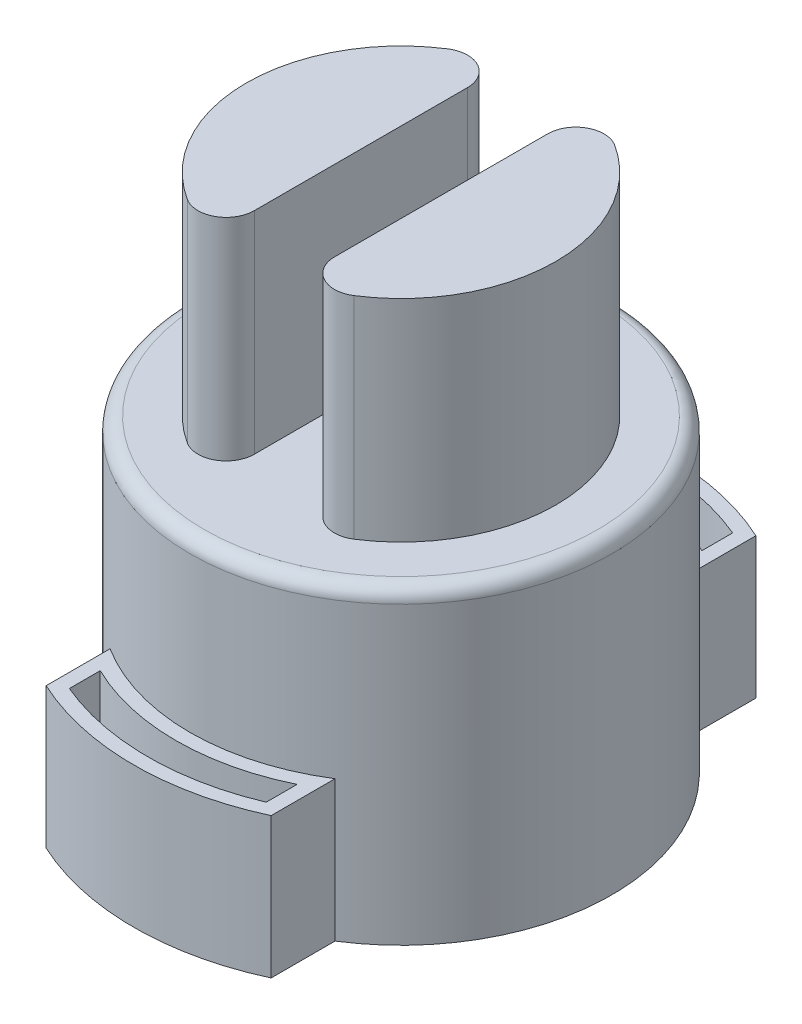
ISO-10303-21;
HEADER;
FILE_DESCRIPTION(('STEP AP214'),'2;1');
FILE_NAME('part.step','',(''),(''),'','','');
FILE_SCHEMA(('AUTOMOTIVE_DESIGN { 1 0 10303 214 1 1 1 1 }'));
ENDSEC;
DATA;
#1=APPLICATION_CONTEXT('core data for automotive mechanical design processes');
#2=APPLICATION_PROTOCOL_DEFINITION('international standard','automotive_design',2000,#1);
#3=PRODUCT_CONTEXT('',#1,'mechanical');
#4=PRODUCT('Part','Part','',(#3));
#5=PRODUCT_RELATED_PRODUCT_CATEGORY('part','',(#4));
#6=PRODUCT_DEFINITION_FORMATION('','',#4);
#7=PRODUCT_DEFINITION_CONTEXT('part definition',#1,'design');
#8=PRODUCT_DEFINITION('design','',#6,#7);
#9=PRODUCT_DEFINITION_SHAPE('','',#8);
#10=(LENGTH_UNIT() NAMED_UNIT(*) SI_UNIT(.MILLI.,.METRE.));
#11=(NAMED_UNIT(*) PLANE_ANGLE_UNIT() SI_UNIT($,.RADIAN.));
#12=(NAMED_UNIT(*) SI_UNIT($,.STERADIAN.) SOLID_ANGLE_UNIT());
#13=UNCERTAINTY_MEASURE_WITH_UNIT(LENGTH_MEASURE(1.E-05),#10,'distance_accuracy_value','');
#14=(GEOMETRIC_REPRESENTATION_CONTEXT(3) GLOBAL_UNCERTAINTY_ASSIGNED_CONTEXT((#13)) GLOBAL_UNIT_ASSIGNED_CONTEXT((#10,
#11,#12)) REPRESENTATION_CONTEXT('',''));
#15=CARTESIAN_POINT('',(0.,0.,0.));
#16=DIRECTION('',(0.,0.,1.));
#17=DIRECTION('',(1.,0.,0.));
#18=AXIS2_PLACEMENT_3D('',#15,#16,#17);
#19=CARTESIAN_POINT('',(0.,15.,0.));
#20=DIRECTION('',(0.,-1.,0.));
#21=DIRECTION('',(0.,0.,-1.));
#22=AXIS2_PLACEMENT_3D('',#19,#20,#21);
#23=CYLINDRICAL_SURFACE('',#22,11.);
#24=CARTESIAN_POINT('',(0.,15.,0.));
#25=DIRECTION('',(0.,1.,0.));
#26=DIRECTION('',(0.,0.,1.));
#27=AXIS2_PLACEMENT_3D('',#24,#25,#26);
#28=CIRCLE('',#27,11.);
#29=CARTESIAN_POINT('',(-5.92777777777778,15.,-9.26614540233877));
#30=VERTEX_POINT('',#29);
#31=CARTESIAN_POINT('',(-5.92777777777778,15.,9.26614540233877));
#32=VERTEX_POINT('',#31);
#33=EDGE_CURVE('E381',#30,#32,#28,.T.);
#34=ORIENTED_EDGE('',*,*,#33,.F.);
#35=DIRECTION('',(0.,-1.,0.));
#36=VECTOR('',#35,1.);
#37=CARTESIAN_POINT('',(-5.92777777777778,15.,-9.26614540233877));
#38=LINE('',#37,#36);
#39=CARTESIAN_POINT('',(-5.92777777777778,0.,-9.26614540233877));
#40=VERTEX_POINT('',#39);
#41=EDGE_CURVE('E411',#30,#40,#38,.T.);
#42=ORIENTED_EDGE('',*,*,#41,.T.);
#43=CARTESIAN_POINT('',(0.,0.,0.));
#44=DIRECTION('',(0.,1.,0.));
#45=DIRECTION('',(0.,0.,1.));
#46=AXIS2_PLACEMENT_3D('',#43,#44,#45);
#47=CIRCLE('',#46,11.);
#48=CARTESIAN_POINT('',(-5.92777777777778,0.,9.26614540233877));
#49=VERTEX_POINT('',#48);
#50=EDGE_CURVE('E386',#40,#49,#47,.T.);
#51=ORIENTED_EDGE('',*,*,#50,.T.);
#52=DIRECTION('',(0.,-1.,0.));
#53=VECTOR('',#52,1.);
#54=CARTESIAN_POINT('',(-5.92777777777778,15.,9.26614540233877));
#55=LINE('',#54,#53);
#56=EDGE_CURVE('E407',#49,#32,#55,.F.);
#57=ORIENTED_EDGE('',*,*,#56,.T.);
#58=EDGE_LOOP('',(#34,#42,#51,#57));
#59=FACE_BOUND('',#58,.T.);
#60=ADVANCED_FACE('F43',(#59),#23,.T.);
#61=CARTESIAN_POINT('',(0.,15.,0.));
#62=DIRECTION('',(0.,1.,0.));
#63=DIRECTION('',(0.,0.,1.));
#64=AXIS2_PLACEMENT_3D('',#61,#62,#63);
#65=PLANE('',#64);
#66=DIRECTION('',(0.,0.,1.));
#67=VECTOR('',#66,1.);
#68=CARTESIAN_POINT('',(-2.85,15.,0.));
#69=LINE('',#68,#67);
#70=CARTESIAN_POINT('',(-2.85,15.,-7.58139169282263));
#71=VERTEX_POINT('',#70);
#72=CARTESIAN_POINT('',(-2.85,15.,7.58139169282263));
#73=VERTEX_POINT('',#72);
#74=EDGE_CURVE('E395',#71,#73,#69,.T.);
#75=ORIENTED_EDGE('',*,*,#74,.F.);
#76=CARTESIAN_POINT('',(-4.85,15.,-7.58139169282263));
#77=DIRECTION('',(0.,1.,0.));
#78=DIRECTION('',(0.,0.,1.));
#79=AXIS2_PLACEMENT_3D('',#76,#77,#78);
#80=CIRCLE('',#79,2.);
#81=EDGE_CURVE('E424',#71,#30,#80,.T.);
#82=ORIENTED_EDGE('',*,*,#81,.T.);
#83=ORIENTED_EDGE('',*,*,#33,.T.);
#84=CARTESIAN_POINT('',(-4.85,15.,7.58139169282263));
#85=DIRECTION('',(0.,1.,0.));
#86=DIRECTION('',(0.,0.,1.));
#87=AXIS2_PLACEMENT_3D('',#84,#85,#86);
#88=CIRCLE('',#87,2.);
#89=EDGE_CURVE('E421',#32,#73,#88,.T.);
#90=ORIENTED_EDGE('',*,*,#89,.T.);
#91=EDGE_LOOP('',(#75,#82,#83,#90));
#92=FACE_BOUND('',#91,.T.);
#93=ADVANCED_FACE('F471',(#92),#65,.T.);
#94=CARTESIAN_POINT('',(0.,-20.,0.));
#95=DIRECTION('',(0.,1.,0.));
#96=DIRECTION('',(0.,0.,1.));
#97=AXIS2_PLACEMENT_3D('',#94,#95,#96);
#98=CYLINDRICAL_SURFACE('',#97,15.);
#99=DIRECTION('',(0.,1.,0.));
#100=VECTOR('',#99,1.);
#101=CARTESIAN_POINT('',(-8.,-22.,12.6885775404495));
#102=LINE('',#101,#100);
#103=CARTESIAN_POINT('',(-8.,-22.,12.6885775404495));
#104=VERTEX_POINT('',#103);
#105=CARTESIAN_POINT('',(-8.,-12.,12.6885775404495));
#106=VERTEX_POINT('',#105);
#107=EDGE_CURVE('E358',#104,#106,#102,.T.);
#108=ORIENTED_EDGE('',*,*,#107,.T.);
#109=CARTESIAN_POINT('',(0.,-12.,0.));
#110=DIRECTION('',(0.,-1.,0.));
#111=DIRECTION('',(0.,0.,-1.));
#112=AXIS2_PLACEMENT_3D('',#109,#110,#111);
#113=CIRCLE('',#112,15.);
#114=CARTESIAN_POINT('',(8.,-12.,12.6885775404495));
#115=VERTEX_POINT('',#114);
#116=EDGE_CURVE('E291',#115,#106,#113,.T.);
#117=ORIENTED_EDGE('',*,*,#116,.F.);
#118=DIRECTION('',(0.,1.,0.));
#119=VECTOR('',#118,1.);
#120=CARTESIAN_POINT('',(8.,-22.,12.6885775404495));
#121=LINE('',#120,#119);
#122=CARTESIAN_POINT('',(8.,-22.,12.6885775404495));
#123=VERTEX_POINT('',#122);
#124=EDGE_CURVE('E367',#123,#115,#121,.T.);
#125=ORIENTED_EDGE('',*,*,#124,.F.);
#126=CARTESIAN_POINT('',(0.,-22.,0.));
#127=DIRECTION('',(0.,-1.,0.));
#128=DIRECTION('',(0.,0.,-1.));
#129=AXIS2_PLACEMENT_3D('',#126,#127,#128);
#130=CIRCLE('',#129,15.);
#131=CARTESIAN_POINT('',(8.,-22.,-12.6885775404495));
#132=VERTEX_POINT('',#131);
#133=EDGE_CURVE('E327',#132,#123,#130,.T.);
#134=ORIENTED_EDGE('',*,*,#133,.F.);
#135=DIRECTION('',(0.,1.,0.));
#136=VECTOR('',#135,1.);
#137=CARTESIAN_POINT('',(8.,-22.,-12.6885775404495));
#138=LINE('',#137,#136);
#139=CARTESIAN_POINT('',(8.,-12.,-12.6885775404495));
#140=VERTEX_POINT('',#139);
#141=EDGE_CURVE('E370',#132,#140,#138,.T.);
#142=ORIENTED_EDGE('',*,*,#141,.T.);
#143=CARTESIAN_POINT('',(0.,-12.,0.));
#144=DIRECTION('',(0.,-1.,0.));
#145=DIRECTION('',(0.,0.,-1.));
#146=AXIS2_PLACEMENT_3D('',#143,#144,#145);
#147=CIRCLE('',#146,15.);
#148=CARTESIAN_POINT('',(-8.,-12.,-12.6885775404495));
#149=VERTEX_POINT('',#148);
#150=EDGE_CURVE('E307',#149,#140,#147,.T.);
#151=ORIENTED_EDGE('',*,*,#150,.F.);
#152=DIRECTION('',(0.,1.,0.));
#153=VECTOR('',#152,1.);
#154=CARTESIAN_POINT('',(-8.,-22.,-12.6885775404495));
#155=LINE('',#154,#153);
#156=CARTESIAN_POINT('',(-8.,-22.,-12.6885775404495));
#157=VERTEX_POINT('',#156);
#158=EDGE_CURVE('E355',#157,#149,#155,.T.);
#159=ORIENTED_EDGE('',*,*,#158,.F.);
#160=CARTESIAN_POINT('',(0.,-22.,0.));
#161=DIRECTION('',(0.,-1.,0.));
#162=DIRECTION('',(0.,0.,-1.));
#163=AXIS2_PLACEMENT_3D('',#160,#161,#162);
#164=CIRCLE('',#163,15.);
#165=EDGE_CURVE('E340',#104,#157,#164,.T.);
#166=ORIENTED_EDGE('',*,*,#165,.F.);
#167=EDGE_LOOP('',(#108,#117,#125,#134,#142,#151,#159,#166));
#168=FACE_BOUND('',#167,.T.);
#169=CARTESIAN_POINT('',(0.,-1.,0.));
#170=DIRECTION('',(0.,1.,0.));
#171=DIRECTION('',(0.,0.,1.));
#172=AXIS2_PLACEMENT_3D('',#169,#170,#171);
#173=CIRCLE('',#172,15.);
#174=CARTESIAN_POINT('',(0.,-1.,15.));
#175=VERTEX_POINT('',#174);
#176=EDGE_CURVE('E403',#175,#175,#173,.F.);
#177=ORIENTED_EDGE('',*,*,#176,.T.);
#178=EDGE_LOOP('',(#177));
#179=FACE_BOUND('',#178,.T.);
#180=ADVANCED_FACE('F498',(#168,#179),#98,.T.);
#181=CARTESIAN_POINT('',(0.,0.,0.));
#182=DIRECTION('',(0.,1.,0.));
#183=DIRECTION('',(0.,0.,1.));
#184=AXIS2_PLACEMENT_3D('',#181,#182,#183);
#185=PLANE('',#184);
#186=CARTESIAN_POINT('',(0.,0.,0.));
#187=DIRECTION('',(0.,1.,0.));
#188=DIRECTION('',(0.,0.,1.));
#189=AXIS2_PLACEMENT_3D('',#186,#187,#188);
#190=CIRCLE('',#189,14.);
#191=CARTESIAN_POINT('',(0.,0.,14.));
#192=VERTEX_POINT('',#191);
#193=EDGE_CURVE('E399',#192,#192,#190,.T.);
#194=ORIENTED_EDGE('',*,*,#193,.T.);
#195=EDGE_LOOP('',(#194));
#196=FACE_BOUND('',#195,.T.);
#197=ORIENTED_EDGE('',*,*,#50,.F.);
#198=CARTESIAN_POINT('',(-4.85,0.,-7.58139169282263));
#199=DIRECTION('',(0.,1.,0.));
#200=DIRECTION('',(0.,0.,1.));
#201=AXIS2_PLACEMENT_3D('',#198,#199,#200);
#202=CIRCLE('',#201,2.);
#203=CARTESIAN_POINT('',(-2.85,0.,-7.58139169282263));
#204=VERTEX_POINT('',#203);
#205=EDGE_CURVE('E447',#40,#204,#202,.F.);
#206=ORIENTED_EDGE('',*,*,#205,.T.);
#207=DIRECTION('',(0.,0.,1.));
#208=VECTOR('',#207,1.);
#209=CARTESIAN_POINT('',(-2.85,0.,-12.));
#210=LINE('',#209,#208);
#211=CARTESIAN_POINT('',(-2.85,0.,7.58139169282263));
#212=VERTEX_POINT('',#211);
#213=EDGE_CURVE('E373',#204,#212,#210,.T.);
#214=ORIENTED_EDGE('',*,*,#213,.T.);
#215=CARTESIAN_POINT('',(-4.85,0.,7.58139169282263));
#216=DIRECTION('',(0.,1.,0.));
#217=DIRECTION('',(0.,0.,1.));
#218=AXIS2_PLACEMENT_3D('',#215,#216,#217);
#219=CIRCLE('',#218,2.);
#220=EDGE_CURVE('E52',#212,#49,#219,.F.);
#221=ORIENTED_EDGE('',*,*,#220,.T.);
#222=EDGE_LOOP('',(#197,#206,#214,#221));
#223=FACE_BOUND('',#222,.T.);
#224=CARTESIAN_POINT('',(5.92777777777778,0.,9.26614540233877));
#225=VERTEX_POINT('',#224);
#226=CARTESIAN_POINT('',(5.92777777777778,0.,-9.26614540233877));
#227=VERTEX_POINT('',#226);
#228=EDGE_CURVE('E387',#225,#227,#47,.T.);
#229=ORIENTED_EDGE('',*,*,#228,.F.);
#230=CARTESIAN_POINT('',(4.85,0.,7.58139169282263));
#231=DIRECTION('',(0.,1.,0.));
#232=DIRECTION('',(0.,0.,1.));
#233=AXIS2_PLACEMENT_3D('',#230,#231,#232);
#234=CIRCLE('',#233,2.);
#235=CARTESIAN_POINT('',(2.85,0.,7.58139169282263));
#236=VERTEX_POINT('',#235);
#237=EDGE_CURVE('E11',#225,#236,#234,.F.);
#238=ORIENTED_EDGE('',*,*,#237,.T.);
#239=DIRECTION('',(0.,0.,-1.));
#240=VECTOR('',#239,1.);
#241=CARTESIAN_POINT('',(2.85,0.,-12.));
#242=LINE('',#241,#240);
#243=CARTESIAN_POINT('',(2.85,0.,-7.58139169282263));
#244=VERTEX_POINT('',#243);
#245=EDGE_CURVE('E377',#236,#244,#242,.T.);
#246=ORIENTED_EDGE('',*,*,#245,.T.);
#247=CARTESIAN_POINT('',(4.85,0.,-7.58139169282263));
#248=DIRECTION('',(0.,1.,0.));
#249=DIRECTION('',(0.,0.,1.));
#250=AXIS2_PLACEMENT_3D('',#247,#248,#249);
#251=CIRCLE('',#250,2.);
#252=EDGE_CURVE('E450',#244,#227,#251,.F.);
#253=ORIENTED_EDGE('',*,*,#252,.T.);
#254=EDGE_LOOP('',(#229,#238,#246,#253));
#255=FACE_BOUND('',#254,.T.);
#256=ADVANCED_FACE('F457',(#196,#223,#255),#185,.T.);
#257=ORIENTED_EDGE('',*,*,#228,.T.);
#258=DIRECTION('',(0.,-1.,0.));
#259=VECTOR('',#258,1.);
#260=CARTESIAN_POINT('',(5.92777777777778,15.,-9.26614540233877));
#261=LINE('',#260,#259);
#262=CARTESIAN_POINT('',(5.92777777777778,15.,-9.26614540233877));
#263=VERTEX_POINT('',#262);
#264=EDGE_CURVE('E431',#227,#263,#261,.F.);
#265=ORIENTED_EDGE('',*,*,#264,.T.);
#266=CARTESIAN_POINT('',(5.92777777777778,15.,9.26614540233877));
#267=VERTEX_POINT('',#266);
#268=EDGE_CURVE('E382',#267,#263,#28,.T.);
#269=ORIENTED_EDGE('',*,*,#268,.F.);
#270=DIRECTION('',(0.,-1.,0.));
#271=VECTOR('',#270,1.);
#272=CARTESIAN_POINT('',(5.92777777777778,15.,9.26614540233877));
#273=LINE('',#272,#271);
#274=EDGE_CURVE('E427',#267,#225,#273,.T.);
#275=ORIENTED_EDGE('',*,*,#274,.T.);
#276=EDGE_LOOP('',(#257,#265,#269,#275));
#277=FACE_BOUND('',#276,.T.);
#278=ADVANCED_FACE('F494',(#277),#23,.T.);
#279=ORIENTED_EDGE('',*,*,#268,.T.);
#280=CARTESIAN_POINT('',(4.85,15.,-7.58139169282263));
#281=DIRECTION('',(0.,1.,0.));
#282=DIRECTION('',(0.,0.,1.));
#283=AXIS2_PLACEMENT_3D('',#280,#281,#282);
#284=CIRCLE('',#283,2.);
#285=CARTESIAN_POINT('',(2.85,15.,-7.58139169282263));
#286=VERTEX_POINT('',#285);
#287=EDGE_CURVE('E438',#263,#286,#284,.T.);
#288=ORIENTED_EDGE('',*,*,#287,.T.);
#289=DIRECTION('',(0.,0.,-1.));
#290=VECTOR('',#289,1.);
#291=CARTESIAN_POINT('',(2.85,15.,0.));
#292=LINE('',#291,#290);
#293=CARTESIAN_POINT('',(2.85,15.,7.58139169282263));
#294=VERTEX_POINT('',#293);
#295=EDGE_CURVE('E391',#294,#286,#292,.T.);
#296=ORIENTED_EDGE('',*,*,#295,.F.);
#297=CARTESIAN_POINT('',(4.85,15.,7.58139169282263));
#298=DIRECTION('',(0.,1.,0.));
#299=DIRECTION('',(0.,0.,1.));
#300=AXIS2_PLACEMENT_3D('',#297,#298,#299);
#301=CIRCLE('',#300,2.);
#302=EDGE_CURVE('E435',#294,#267,#301,.T.);
#303=ORIENTED_EDGE('',*,*,#302,.T.);
#304=EDGE_LOOP('',(#279,#288,#296,#303));
#305=FACE_BOUND('',#304,.T.);
#306=ADVANCED_FACE('F500',(#305),#65,.T.);
#307=CARTESIAN_POINT('',(-2.85,0.,-12.));
#308=DIRECTION('',(-1.,0.,0.));
#309=DIRECTION('',(0.,0.,1.));
#310=AXIS2_PLACEMENT_3D('',#307,#308,#309);
#311=PLANE('',#310);
#312=ORIENTED_EDGE('',*,*,#213,.F.);
#313=DIRECTION('',(0.,-1.,0.));
#314=VECTOR('',#313,1.);
#315=CARTESIAN_POINT('',(-2.85,0.,-7.58139169282263));
#316=LINE('',#315,#314);
#317=EDGE_CURVE('E418',#204,#71,#316,.F.);
#318=ORIENTED_EDGE('',*,*,#317,.T.);
#319=ORIENTED_EDGE('',*,*,#74,.T.);
#320=DIRECTION('',(0.,-1.,0.));
#321=VECTOR('',#320,1.);
#322=CARTESIAN_POINT('',(-2.85,0.,7.58139169282263));
#323=LINE('',#322,#321);
#324=EDGE_CURVE('E415',#73,#212,#323,.T.);
#325=ORIENTED_EDGE('',*,*,#324,.T.);
#326=EDGE_LOOP('',(#312,#318,#319,#325));
#327=FACE_BOUND('',#326,.T.);
#328=ADVANCED_FACE('F474',(#327),#311,.F.);
#329=CARTESIAN_POINT('',(2.85,0.,-12.));
#330=DIRECTION('',(1.,0.,0.));
#331=DIRECTION('',(0.,0.,-1.));
#332=AXIS2_PLACEMENT_3D('',#329,#330,#331);
#333=PLANE('',#332);
#334=ORIENTED_EDGE('',*,*,#295,.T.);
#335=DIRECTION('',(0.,-1.,0.));
#336=VECTOR('',#335,1.);
#337=CARTESIAN_POINT('',(2.85,0.,-7.58139169282263));
#338=LINE('',#337,#336);
#339=EDGE_CURVE('E444',#286,#244,#338,.T.);
#340=ORIENTED_EDGE('',*,*,#339,.T.);
#341=ORIENTED_EDGE('',*,*,#245,.F.);
#342=DIRECTION('',(0.,-1.,0.));
#343=VECTOR('',#342,1.);
#344=CARTESIAN_POINT('',(2.85,0.,7.58139169282263));
#345=LINE('',#344,#343);
#346=EDGE_CURVE('E441',#236,#294,#345,.F.);
#347=ORIENTED_EDGE('',*,*,#346,.T.);
#348=EDGE_LOOP('',(#334,#340,#341,#347));
#349=FACE_BOUND('',#348,.T.);
#350=ADVANCED_FACE('F489',(#349),#333,.F.);
#351=CARTESIAN_POINT('',(0.,-1.,0.));
#352=DIRECTION('',(0.,1.,0.));
#353=DIRECTION('',(0.,0.,1.));
#354=AXIS2_PLACEMENT_3D('',#351,#352,#353);
#355=TOROIDAL_SURFACE('',#354,14.,1.);
#356=ORIENTED_EDGE('',*,*,#176,.F.);
#357=EDGE_LOOP('',(#356));
#358=FACE_BOUND('',#357,.T.);
#359=ORIENTED_EDGE('',*,*,#193,.F.);
#360=EDGE_LOOP('',(#359));
#361=FACE_BOUND('',#360,.T.);
#362=ADVANCED_FACE('F481',(#358,#361),#355,.T.);
#363=CARTESIAN_POINT('',(-4.85,15.,-7.58139169282263));
#364=DIRECTION('',(0.,-1.,0.));
#365=DIRECTION('',(0.,0.,-1.));
#366=AXIS2_PLACEMENT_3D('',#363,#364,#365);
#367=CYLINDRICAL_SURFACE('',#366,2.);
#368=ORIENTED_EDGE('',*,*,#81,.F.);
#369=ORIENTED_EDGE('',*,*,#317,.F.);
#370=ORIENTED_EDGE('',*,*,#205,.F.);
#371=ORIENTED_EDGE('',*,*,#41,.F.);
#372=EDGE_LOOP('',(#368,#369,#370,#371));
#373=FACE_BOUND('',#372,.T.);
#374=ADVANCED_FACE('F477',(#373),#367,.T.);
#375=CARTESIAN_POINT('',(4.85,15.,-7.58139169282263));
#376=DIRECTION('',(0.,-1.,0.));
#377=DIRECTION('',(0.,0.,-1.));
#378=AXIS2_PLACEMENT_3D('',#375,#376,#377);
#379=CYLINDRICAL_SURFACE('',#378,2.);
#380=ORIENTED_EDGE('',*,*,#252,.F.);
#381=ORIENTED_EDGE('',*,*,#339,.F.);
#382=ORIENTED_EDGE('',*,*,#287,.F.);
#383=ORIENTED_EDGE('',*,*,#264,.F.);
#384=EDGE_LOOP('',(#380,#381,#382,#383));
#385=FACE_BOUND('',#384,.T.);
#386=ADVANCED_FACE('F480',(#385),#379,.T.);
#387=CARTESIAN_POINT('',(-4.85,15.,7.58139169282263));
#388=DIRECTION('',(0.,-1.,0.));
#389=DIRECTION('',(0.,0.,-1.));
#390=AXIS2_PLACEMENT_3D('',#387,#388,#389);
#391=CYLINDRICAL_SURFACE('',#390,2.);
#392=ORIENTED_EDGE('',*,*,#220,.F.);
#393=ORIENTED_EDGE('',*,*,#324,.F.);
#394=ORIENTED_EDGE('',*,*,#89,.F.);
#395=ORIENTED_EDGE('',*,*,#56,.F.);
#396=EDGE_LOOP('',(#392,#393,#394,#395));
#397=FACE_BOUND('',#396,.T.);
#398=ADVANCED_FACE('F468',(#397),#391,.T.);
#399=CARTESIAN_POINT('',(4.85,15.,7.58139169282263));
#400=DIRECTION('',(0.,-1.,0.));
#401=DIRECTION('',(0.,0.,-1.));
#402=AXIS2_PLACEMENT_3D('',#399,#400,#401);
#403=CYLINDRICAL_SURFACE('',#402,2.);
#404=ORIENTED_EDGE('',*,*,#302,.F.);
#405=ORIENTED_EDGE('',*,*,#346,.F.);
#406=ORIENTED_EDGE('',*,*,#237,.F.);
#407=ORIENTED_EDGE('',*,*,#274,.F.);
#408=EDGE_LOOP('',(#404,#405,#406,#407));
#409=FACE_BOUND('',#408,.T.);
#410=ADVANCED_FACE('F45',(#409),#403,.T.);
#411=CARTESIAN_POINT('',(8.,-22.,0.));
#412=DIRECTION('',(1.,0.,0.));
#413=DIRECTION('',(0.,0.,-1.));
#414=AXIS2_PLACEMENT_3D('',#411,#412,#413);
#415=PLANE('',#414);
#416=DIRECTION('',(0.,1.,0.));
#417=VECTOR('',#416,1.);
#418=CARTESIAN_POINT('',(8.,-22.,-17.2336879396141));
#419=LINE('',#418,#417);
#420=CARTESIAN_POINT('',(8.,-22.,-17.2336879396141));
#421=VERTEX_POINT('',#420);
#422=CARTESIAN_POINT('',(8.,-12.,-17.2336879396141));
#423=VERTEX_POINT('',#422);
#424=EDGE_CURVE('E349',#421,#423,#419,.T.);
#425=ORIENTED_EDGE('',*,*,#424,.T.);
#426=DIRECTION('',(0.,0.,1.));
#427=VECTOR('',#426,1.);
#428=CARTESIAN_POINT('',(8.,-12.,0.));
#429=LINE('',#428,#427);
#430=EDGE_CURVE('E319',#423,#140,#429,.T.);
#431=ORIENTED_EDGE('',*,*,#430,.T.);
#432=ORIENTED_EDGE('',*,*,#141,.F.);
#433=DIRECTION('',(0.,0.,-1.));
#434=VECTOR('',#433,1.);
#435=CARTESIAN_POINT('',(8.,-22.,0.));
#436=LINE('',#435,#434);
#437=EDGE_CURVE('E323',#132,#421,#436,.T.);
#438=ORIENTED_EDGE('',*,*,#437,.T.);
#439=EDGE_LOOP('',(#425,#431,#432,#438));
#440=FACE_BOUND('',#439,.T.);
#441=ADVANCED_FACE('F523',(#440),#415,.T.);
#442=CARTESIAN_POINT('',(8.,-22.,0.));
#443=DIRECTION('',(1.,0.,0.));
#444=DIRECTION('',(0.,0.,-1.));
#445=AXIS2_PLACEMENT_3D('',#442,#443,#444);
#446=PLANE('',#445);
#447=ORIENTED_EDGE('',*,*,#124,.T.);
#448=DIRECTION('',(0.,0.,1.));
#449=VECTOR('',#448,1.);
#450=CARTESIAN_POINT('',(8.,-12.,0.));
#451=LINE('',#450,#449);
#452=CARTESIAN_POINT('',(8.,-12.,17.2336879396141));
#453=VERTEX_POINT('',#452);
#454=EDGE_CURVE('E295',#115,#453,#451,.T.);
#455=ORIENTED_EDGE('',*,*,#454,.T.);
#456=DIRECTION('',(0.,1.,0.));
#457=VECTOR('',#456,1.);
#458=CARTESIAN_POINT('',(8.,-22.,17.2336879396141));
#459=LINE('',#458,#457);
#460=CARTESIAN_POINT('',(8.,-22.,17.2336879396141));
#461=VERTEX_POINT('',#460);
#462=EDGE_CURVE('E364',#461,#453,#459,.T.);
#463=ORIENTED_EDGE('',*,*,#462,.F.);
#464=DIRECTION('',(0.,0.,-1.));
#465=VECTOR('',#464,1.);
#466=CARTESIAN_POINT('',(8.,-22.,0.));
#467=LINE('',#466,#465);
#468=EDGE_CURVE('E330',#461,#123,#467,.T.);
#469=ORIENTED_EDGE('',*,*,#468,.T.);
#470=EDGE_LOOP('',(#447,#455,#463,#469));
#471=FACE_BOUND('',#470,.T.);
#472=ADVANCED_FACE('F529',(#471),#446,.T.);
#473=CARTESIAN_POINT('',(0.,-22.,0.));
#474=DIRECTION('',(0.,1.,0.));
#475=DIRECTION('',(0.,0.,1.));
#476=AXIS2_PLACEMENT_3D('',#473,#474,#475);
#477=CYLINDRICAL_SURFACE('',#476,19.);
#478=ORIENTED_EDGE('',*,*,#462,.T.);
#479=CARTESIAN_POINT('',(0.,-12.,0.));
#480=DIRECTION('',(0.,-1.,0.));
#481=DIRECTION('',(0.,0.,-1.));
#482=AXIS2_PLACEMENT_3D('',#479,#480,#481);
#483=CIRCLE('',#482,19.);
#484=CARTESIAN_POINT('',(-8.,-12.,17.2336879396141));
#485=VERTEX_POINT('',#484);
#486=EDGE_CURVE('E299',#453,#485,#483,.T.);
#487=ORIENTED_EDGE('',*,*,#486,.T.);
#488=DIRECTION('',(0.,1.,0.));
#489=VECTOR('',#488,1.);
#490=CARTESIAN_POINT('',(-8.,-22.,17.2336879396141));
#491=LINE('',#490,#489);
#492=CARTESIAN_POINT('',(-8.,-22.,17.2336879396141));
#493=VERTEX_POINT('',#492);
#494=EDGE_CURVE('E361',#493,#485,#491,.T.);
#495=ORIENTED_EDGE('',*,*,#494,.F.);
#496=CARTESIAN_POINT('',(0.,-22.,0.));
#497=DIRECTION('',(0.,-1.,0.));
#498=DIRECTION('',(0.,0.,-1.));
#499=AXIS2_PLACEMENT_3D('',#496,#497,#498);
#500=CIRCLE('',#499,19.);
#501=EDGE_CURVE('E334',#461,#493,#500,.T.);
#502=ORIENTED_EDGE('',*,*,#501,.F.);
#503=EDGE_LOOP('',(#478,#487,#495,#502));
#504=FACE_BOUND('',#503,.T.);
#505=ADVANCED_FACE('F631',(#504),#477,.T.);
#506=CARTESIAN_POINT('',(-8.,-22.,0.));
#507=DIRECTION('',(1.,0.,0.));
#508=DIRECTION('',(0.,0.,-1.));
#509=AXIS2_PLACEMENT_3D('',#506,#507,#508);
#510=PLANE('',#509);
#511=ORIENTED_EDGE('',*,*,#494,.T.);
#512=DIRECTION('',(0.,0.,-1.));
#513=VECTOR('',#512,1.);
#514=CARTESIAN_POINT('',(-8.,-12.,0.));
#515=LINE('',#514,#513);
#516=EDGE_CURVE('E303',#485,#106,#515,.T.);
#517=ORIENTED_EDGE('',*,*,#516,.T.);
#518=ORIENTED_EDGE('',*,*,#107,.F.);
#519=DIRECTION('',(0.,0.,-1.));
#520=VECTOR('',#519,1.);
#521=CARTESIAN_POINT('',(-8.,-22.,0.));
#522=LINE('',#521,#520);
#523=EDGE_CURVE('E337',#493,#104,#522,.T.);
#524=ORIENTED_EDGE('',*,*,#523,.F.);
#525=EDGE_LOOP('',(#511,#517,#518,#524));
#526=FACE_BOUND('',#525,.T.);
#527=ADVANCED_FACE('F642',(#526),#510,.F.);
#528=CARTESIAN_POINT('',(-8.,-22.,0.));
#529=DIRECTION('',(1.,0.,0.));
#530=DIRECTION('',(0.,0.,-1.));
#531=AXIS2_PLACEMENT_3D('',#528,#529,#530);
#532=PLANE('',#531);
#533=ORIENTED_EDGE('',*,*,#158,.T.);
#534=DIRECTION('',(0.,0.,-1.));
#535=VECTOR('',#534,1.);
#536=CARTESIAN_POINT('',(-8.,-12.,0.));
#537=LINE('',#536,#535);
#538=CARTESIAN_POINT('',(-8.,-12.,-17.2336879396141));
#539=VERTEX_POINT('',#538);
#540=EDGE_CURVE('E311',#149,#539,#537,.T.);
#541=ORIENTED_EDGE('',*,*,#540,.T.);
#542=DIRECTION('',(0.,1.,0.));
#543=VECTOR('',#542,1.);
#544=CARTESIAN_POINT('',(-8.,-22.,-17.2336879396141));
#545=LINE('',#544,#543);
#546=CARTESIAN_POINT('',(-8.,-22.,-17.2336879396141));
#547=VERTEX_POINT('',#546);
#548=EDGE_CURVE('E352',#547,#539,#545,.T.);
#549=ORIENTED_EDGE('',*,*,#548,.F.);
#550=DIRECTION('',(0.,0.,-1.));
#551=VECTOR('',#550,1.);
#552=CARTESIAN_POINT('',(-8.,-22.,0.));
#553=LINE('',#552,#551);
#554=EDGE_CURVE('E343',#157,#547,#553,.T.);
#555=ORIENTED_EDGE('',*,*,#554,.F.);
#556=EDGE_LOOP('',(#533,#541,#549,#555));
#557=FACE_BOUND('',#556,.T.);
#558=ADVANCED_FACE('F653',(#557),#532,.F.);
#559=CARTESIAN_POINT('',(0.,-22.,0.));
#560=DIRECTION('',(0.,1.,0.));
#561=DIRECTION('',(0.,0.,1.));
#562=AXIS2_PLACEMENT_3D('',#559,#560,#561);
#563=CYLINDRICAL_SURFACE('',#562,19.);
#564=ORIENTED_EDGE('',*,*,#548,.T.);
#565=CARTESIAN_POINT('',(0.,-12.,0.));
#566=DIRECTION('',(0.,-1.,0.));
#567=DIRECTION('',(0.,0.,-1.));
#568=AXIS2_PLACEMENT_3D('',#565,#566,#567);
#569=CIRCLE('',#568,19.);
#570=EDGE_CURVE('E315',#539,#423,#569,.T.);
#571=ORIENTED_EDGE('',*,*,#570,.T.);
#572=ORIENTED_EDGE('',*,*,#424,.F.);
#573=CARTESIAN_POINT('',(0.,-22.,0.));
#574=DIRECTION('',(0.,-1.,0.));
#575=DIRECTION('',(0.,0.,-1.));
#576=AXIS2_PLACEMENT_3D('',#573,#574,#575);
#577=CIRCLE('',#576,19.);
#578=EDGE_CURVE('E346',#547,#421,#577,.T.);
#579=ORIENTED_EDGE('',*,*,#578,.F.);
#580=EDGE_LOOP('',(#564,#571,#572,#579));
#581=FACE_BOUND('',#580,.T.);
#582=ADVANCED_FACE('F664',(#581),#563,.T.);
#583=CARTESIAN_POINT('',(0.,-22.,0.));
#584=DIRECTION('',(0.,-1.,0.));
#585=DIRECTION('',(0.,0.,-1.));
#586=AXIS2_PLACEMENT_3D('',#583,#584,#585);
#587=PLANE('',#586);
#588=CARTESIAN_POINT('',(0.,-22.,0.));
#589=DIRECTION('',(0.,-1.,0.));
#590=DIRECTION('',(0.,0.,-1.));
#591=AXIS2_PLACEMENT_3D('',#588,#589,#590);
#592=CIRCLE('',#591,16.);
#593=CARTESIAN_POINT('',(-7.,-22.,14.3874945699382));
#594=VERTEX_POINT('',#593);
#595=CARTESIAN_POINT('',(7.,-22.,14.3874945699382));
#596=VERTEX_POINT('',#595);
#597=EDGE_CURVE('E247',#594,#596,#592,.F.);
#598=ORIENTED_EDGE('',*,*,#597,.F.);
#599=DIRECTION('',(0.,0.,-1.));
#600=VECTOR('',#599,1.);
#601=CARTESIAN_POINT('',(-6.99999999999998,-22.,0.));
#602=LINE('',#601,#600);
#603=CARTESIAN_POINT('',(-7.,-22.,16.583123951777));
#604=VERTEX_POINT('',#603);
#605=EDGE_CURVE('E235',#604,#594,#602,.T.);
#606=ORIENTED_EDGE('',*,*,#605,.F.);
#607=CARTESIAN_POINT('',(0.,-22.,0.));
#608=DIRECTION('',(0.,-1.,0.));
#609=DIRECTION('',(0.,0.,-1.));
#610=AXIS2_PLACEMENT_3D('',#607,#608,#609);
#611=CIRCLE('',#610,18.);
#612=CARTESIAN_POINT('',(7.,-22.,16.583123951777));
#613=VERTEX_POINT('',#612);
#614=EDGE_CURVE('E210',#613,#604,#611,.T.);
#615=ORIENTED_EDGE('',*,*,#614,.F.);
#616=DIRECTION('',(0.,0.,1.));
#617=VECTOR('',#616,1.);
#618=CARTESIAN_POINT('',(6.99999999999999,-22.,0.));
#619=LINE('',#618,#617);
#620=EDGE_CURVE('E244',#596,#613,#619,.T.);
#621=ORIENTED_EDGE('',*,*,#620,.F.);
#622=EDGE_LOOP('',(#598,#606,#615,#621));
#623=FACE_BOUND('',#622,.T.);
#624=CARTESIAN_POINT('',(0.,-22.,0.));
#625=DIRECTION('',(0.,-1.,0.));
#626=DIRECTION('',(0.,0.,-1.));
#627=AXIS2_PLACEMENT_3D('',#624,#625,#626);
#628=CIRCLE('',#627,16.);
#629=CARTESIAN_POINT('',(7.,-22.,-14.3874945699382));
#630=VERTEX_POINT('',#629);
#631=CARTESIAN_POINT('',(-7.,-22.,-14.3874945699382));
#632=VERTEX_POINT('',#631);
#633=EDGE_CURVE('E288',#630,#632,#628,.F.);
#634=ORIENTED_EDGE('',*,*,#633,.F.);
#635=DIRECTION('',(0.,0.,1.));
#636=VECTOR('',#635,1.);
#637=CARTESIAN_POINT('',(7.00000000000002,-22.,0.));
#638=LINE('',#637,#636);
#639=CARTESIAN_POINT('',(7.,-22.,-16.583123951777));
#640=VERTEX_POINT('',#639);
#641=EDGE_CURVE('E269',#640,#630,#638,.T.);
#642=ORIENTED_EDGE('',*,*,#641,.F.);
#643=CARTESIAN_POINT('',(0.,-22.,0.));
#644=DIRECTION('',(0.,-1.,0.));
#645=DIRECTION('',(0.,0.,-1.));
#646=AXIS2_PLACEMENT_3D('',#643,#644,#645);
#647=CIRCLE('',#646,18.);
#648=CARTESIAN_POINT('',(-6.99999999999999,-22.,-16.583123951777));
#649=VERTEX_POINT('',#648);
#650=EDGE_CURVE('E281',#649,#640,#647,.T.);
#651=ORIENTED_EDGE('',*,*,#650,.F.);
#652=DIRECTION('',(0.,0.,-1.));
#653=VECTOR('',#652,1.);
#654=CARTESIAN_POINT('',(-6.99999999999999,-22.,0.));
#655=LINE('',#654,#653);
#656=EDGE_CURVE('E285',#632,#649,#655,.T.);
#657=ORIENTED_EDGE('',*,*,#656,.F.);
#658=EDGE_LOOP('',(#634,#642,#651,#657));
#659=FACE_BOUND('',#658,.T.);
#660=ORIENTED_EDGE('',*,*,#523,.T.);
#661=ORIENTED_EDGE('',*,*,#165,.T.);
#662=ORIENTED_EDGE('',*,*,#554,.T.);
#663=ORIENTED_EDGE('',*,*,#578,.T.);
#664=ORIENTED_EDGE('',*,*,#437,.F.);
#665=ORIENTED_EDGE('',*,*,#133,.T.);
#666=ORIENTED_EDGE('',*,*,#468,.F.);
#667=ORIENTED_EDGE('',*,*,#501,.T.);
#668=EDGE_LOOP('',(#660,#661,#662,#663,#664,#665,#666,#667));
#669=FACE_BOUND('',#668,.T.);
#670=ADVANCED_FACE('F675',(#623,#659,#669),#587,.T.);
#671=CARTESIAN_POINT('',(0.,-12.,0.));
#672=DIRECTION('',(0.,-1.,0.));
#673=DIRECTION('',(0.,0.,-1.));
#674=AXIS2_PLACEMENT_3D('',#671,#672,#673);
#675=PLANE('',#674);
#676=DIRECTION('',(0.,0.,-1.));
#677=VECTOR('',#676,1.);
#678=CARTESIAN_POINT('',(7.,-12.,-14.3874945699382));
#679=LINE('',#678,#677);
#680=CARTESIAN_POINT('',(7.,-12.,-14.3874945699382));
#681=VERTEX_POINT('',#680);
#682=CARTESIAN_POINT('',(7.,-12.,-16.583123951777));
#683=VERTEX_POINT('',#682);
#684=EDGE_CURVE('E253',#681,#683,#679,.T.);
#685=ORIENTED_EDGE('',*,*,#684,.F.);
#686=CARTESIAN_POINT('',(0.,-12.,0.));
#687=DIRECTION('',(0.,-1.,0.));
#688=DIRECTION('',(0.,0.,1.));
#689=AXIS2_PLACEMENT_3D('',#686,#687,#688);
#690=CIRCLE('',#689,16.);
#691=CARTESIAN_POINT('',(-7.,-12.,-14.3874945699382));
#692=VERTEX_POINT('',#691);
#693=EDGE_CURVE('E250',#692,#681,#690,.T.);
#694=ORIENTED_EDGE('',*,*,#693,.F.);
#695=DIRECTION('',(0.,0.,1.));
#696=VECTOR('',#695,1.);
#697=CARTESIAN_POINT('',(-7.,-12.,-16.583123951777));
#698=LINE('',#697,#696);
#699=CARTESIAN_POINT('',(-6.99999999999999,-12.,-16.583123951777));
#700=VERTEX_POINT('',#699);
#701=EDGE_CURVE('E261',#700,#692,#698,.T.);
#702=ORIENTED_EDGE('',*,*,#701,.F.);
#703=CARTESIAN_POINT('',(0.,-12.,0.));
#704=DIRECTION('',(0.,1.,0.));
#705=DIRECTION('',(0.,0.,1.));
#706=AXIS2_PLACEMENT_3D('',#703,#704,#705);
#707=CIRCLE('',#706,18.);
#708=EDGE_CURVE('E257',#683,#700,#707,.T.);
#709=ORIENTED_EDGE('',*,*,#708,.F.);
#710=EDGE_LOOP('',(#685,#694,#702,#709));
#711=FACE_BOUND('',#710,.T.);
#712=ORIENTED_EDGE('',*,*,#150,.T.);
#713=ORIENTED_EDGE('',*,*,#430,.F.);
#714=ORIENTED_EDGE('',*,*,#570,.F.);
#715=ORIENTED_EDGE('',*,*,#540,.F.);
#716=EDGE_LOOP('',(#712,#713,#714,#715));
#717=FACE_BOUND('',#716,.T.);
#718=ADVANCED_FACE('F683',(#711,#717),#675,.F.);
#719=CARTESIAN_POINT('',(0.,-12.,0.));
#720=DIRECTION('',(0.,-1.,0.));
#721=DIRECTION('',(0.,0.,-1.));
#722=AXIS2_PLACEMENT_3D('',#719,#720,#721);
#723=PLANE('',#722);
#724=DIRECTION('',(0.,0.,1.));
#725=VECTOR('',#724,1.);
#726=CARTESIAN_POINT('',(-7.,-12.,14.3874945699382));
#727=LINE('',#726,#725);
#728=CARTESIAN_POINT('',(-7.,-12.,14.3874945699382));
#729=VERTEX_POINT('',#728);
#730=CARTESIAN_POINT('',(-7.,-12.,16.583123951777));
#731=VERTEX_POINT('',#730);
#732=EDGE_CURVE('E217',#729,#731,#727,.T.);
#733=ORIENTED_EDGE('',*,*,#732,.F.);
#734=CARTESIAN_POINT('',(0.,-12.,0.));
#735=DIRECTION('',(0.,-1.,0.));
#736=DIRECTION('',(0.,0.,1.));
#737=AXIS2_PLACEMENT_3D('',#734,#735,#736);
#738=CIRCLE('',#737,16.);
#739=CARTESIAN_POINT('',(7.,-12.,14.3874945699382));
#740=VERTEX_POINT('',#739);
#741=EDGE_CURVE('E67',#740,#729,#738,.T.);
#742=ORIENTED_EDGE('',*,*,#741,.F.);
#743=DIRECTION('',(0.,0.,-1.));
#744=VECTOR('',#743,1.);
#745=CARTESIAN_POINT('',(7.,-12.,16.583123951777));
#746=LINE('',#745,#744);
#747=CARTESIAN_POINT('',(7.,-12.,16.583123951777));
#748=VERTEX_POINT('',#747);
#749=EDGE_CURVE('E225',#748,#740,#746,.T.);
#750=ORIENTED_EDGE('',*,*,#749,.F.);
#751=CARTESIAN_POINT('',(0.,-12.,0.));
#752=DIRECTION('',(0.,1.,0.));
#753=DIRECTION('',(0.,0.,1.));
#754=AXIS2_PLACEMENT_3D('',#751,#752,#753);
#755=CIRCLE('',#754,18.);
#756=EDGE_CURVE('E207',#731,#748,#755,.T.);
#757=ORIENTED_EDGE('',*,*,#756,.F.);
#758=EDGE_LOOP('',(#733,#742,#750,#757));
#759=FACE_BOUND('',#758,.T.);
#760=ORIENTED_EDGE('',*,*,#116,.T.);
#761=ORIENTED_EDGE('',*,*,#516,.F.);
#762=ORIENTED_EDGE('',*,*,#486,.F.);
#763=ORIENTED_EDGE('',*,*,#454,.F.);
#764=EDGE_LOOP('',(#760,#761,#762,#763));
#765=FACE_BOUND('',#764,.T.);
#766=ADVANCED_FACE('F222',(#759,#765),#723,.F.);
#767=CARTESIAN_POINT('',(0.,-23.,0.));
#768=DIRECTION('',(0.,1.,0.));
#769=DIRECTION('',(0.,0.,1.));
#770=AXIS2_PLACEMENT_3D('',#767,#768,#769);
#771=CYLINDRICAL_SURFACE('',#770,16.);
#772=ORIENTED_EDGE('',*,*,#633,.T.);
#773=DIRECTION('',(0.,1.,0.));
#774=VECTOR('',#773,1.);
#775=CARTESIAN_POINT('',(-7.,-23.,-14.3874945699382));
#776=LINE('',#775,#774);
#777=EDGE_CURVE('E266',#632,#692,#776,.T.);
#778=ORIENTED_EDGE('',*,*,#777,.T.);
#779=ORIENTED_EDGE('',*,*,#693,.T.);
#780=DIRECTION('',(0.,1.,0.));
#781=VECTOR('',#780,1.);
#782=CARTESIAN_POINT('',(7.,-23.,-14.3874945699382));
#783=LINE('',#782,#781);
#784=EDGE_CURVE('E265',#630,#681,#783,.T.);
#785=ORIENTED_EDGE('',*,*,#784,.F.);
#786=EDGE_LOOP('',(#772,#778,#779,#785));
#787=FACE_BOUND('',#786,.T.);
#788=ADVANCED_FACE('F694',(#787),#771,.T.);
#789=CARTESIAN_POINT('',(-7.,-23.,-16.583123951777));
#790=DIRECTION('',(-1.,0.,0.));
#791=DIRECTION('',(0.,0.,1.));
#792=AXIS2_PLACEMENT_3D('',#789,#790,#791);
#793=PLANE('',#792);
#794=ORIENTED_EDGE('',*,*,#656,.T.);
#795=DIRECTION('',(0.,1.,0.));
#796=VECTOR('',#795,1.);
#797=CARTESIAN_POINT('',(-6.99999999999999,-23.,-16.583123951777));
#798=LINE('',#797,#796);
#799=EDGE_CURVE('E270',#649,#700,#798,.T.);
#800=ORIENTED_EDGE('',*,*,#799,.T.);
#801=ORIENTED_EDGE('',*,*,#701,.T.);
#802=ORIENTED_EDGE('',*,*,#777,.F.);
#803=EDGE_LOOP('',(#794,#800,#801,#802));
#804=FACE_BOUND('',#803,.T.);
#805=ADVANCED_FACE('F699',(#804),#793,.F.);
#806=CARTESIAN_POINT('',(0.,-23.,0.));
#807=DIRECTION('',(0.,1.,0.));
#808=DIRECTION('',(0.,0.,1.));
#809=AXIS2_PLACEMENT_3D('',#806,#807,#808);
#810=CYLINDRICAL_SURFACE('',#809,18.);
#811=ORIENTED_EDGE('',*,*,#650,.T.);
#812=DIRECTION('',(0.,1.,0.));
#813=VECTOR('',#812,1.);
#814=CARTESIAN_POINT('',(7.,-23.,-16.583123951777));
#815=LINE('',#814,#813);
#816=EDGE_CURVE('E273',#640,#683,#815,.T.);
#817=ORIENTED_EDGE('',*,*,#816,.T.);
#818=ORIENTED_EDGE('',*,*,#708,.T.);
#819=ORIENTED_EDGE('',*,*,#799,.F.);
#820=EDGE_LOOP('',(#811,#817,#818,#819));
#821=FACE_BOUND('',#820,.T.);
#822=ADVANCED_FACE('F709',(#821),#810,.F.);
#823=CARTESIAN_POINT('',(7.,-23.,-14.3874945699382));
#824=DIRECTION('',(1.,0.,0.));
#825=DIRECTION('',(0.,0.,-1.));
#826=AXIS2_PLACEMENT_3D('',#823,#824,#825);
#827=PLANE('',#826);
#828=ORIENTED_EDGE('',*,*,#641,.T.);
#829=ORIENTED_EDGE('',*,*,#784,.T.);
#830=ORIENTED_EDGE('',*,*,#684,.T.);
#831=ORIENTED_EDGE('',*,*,#816,.F.);
#832=EDGE_LOOP('',(#828,#829,#830,#831));
#833=FACE_BOUND('',#832,.T.);
#834=ADVANCED_FACE('F719',(#833),#827,.F.);
#835=CARTESIAN_POINT('',(0.,-23.,0.));
#836=DIRECTION('',(0.,1.,0.));
#837=DIRECTION('',(0.,0.,1.));
#838=AXIS2_PLACEMENT_3D('',#835,#836,#837);
#839=CYLINDRICAL_SURFACE('',#838,16.);
#840=ORIENTED_EDGE('',*,*,#597,.T.);
#841=DIRECTION('',(0.,1.,0.));
#842=VECTOR('',#841,1.);
#843=CARTESIAN_POINT('',(7.,-23.,14.3874945699382));
#844=LINE('',#843,#842);
#845=EDGE_CURVE('E232',#596,#740,#844,.T.);
#846=ORIENTED_EDGE('',*,*,#845,.T.);
#847=ORIENTED_EDGE('',*,*,#741,.T.);
#848=DIRECTION('',(0.,1.,0.));
#849=VECTOR('',#848,1.);
#850=CARTESIAN_POINT('',(-7.,-23.,14.3874945699382));
#851=LINE('',#850,#849);
#852=EDGE_CURVE('E214',#594,#729,#851,.T.);
#853=ORIENTED_EDGE('',*,*,#852,.F.);
#854=EDGE_LOOP('',(#840,#846,#847,#853));
#855=FACE_BOUND('',#854,.T.);
#856=ADVANCED_FACE('F729',(#855),#839,.T.);
#857=CARTESIAN_POINT('',(7.,-23.,16.583123951777));
#858=DIRECTION('',(1.,0.,0.));
#859=DIRECTION('',(0.,0.,-1.));
#860=AXIS2_PLACEMENT_3D('',#857,#858,#859);
#861=PLANE('',#860);
#862=ORIENTED_EDGE('',*,*,#620,.T.);
#863=DIRECTION('',(0.,1.,0.));
#864=VECTOR('',#863,1.);
#865=CARTESIAN_POINT('',(7.,-23.,16.583123951777));
#866=LINE('',#865,#864);
#867=EDGE_CURVE('E213',#613,#748,#866,.T.);
#868=ORIENTED_EDGE('',*,*,#867,.T.);
#869=ORIENTED_EDGE('',*,*,#749,.T.);
#870=ORIENTED_EDGE('',*,*,#845,.F.);
#871=EDGE_LOOP('',(#862,#868,#869,#870));
#872=FACE_BOUND('',#871,.T.);
#873=ADVANCED_FACE('F754',(#872),#861,.F.);
#874=CARTESIAN_POINT('',(0.,-23.,0.));
#875=DIRECTION('',(0.,1.,0.));
#876=DIRECTION('',(0.,0.,1.));
#877=AXIS2_PLACEMENT_3D('',#874,#875,#876);
#878=CYLINDRICAL_SURFACE('',#877,18.);
#879=ORIENTED_EDGE('',*,*,#614,.T.);
#880=DIRECTION('',(0.,1.,0.));
#881=VECTOR('',#880,1.);
#882=CARTESIAN_POINT('',(-7.,-23.,16.583123951777));
#883=LINE('',#882,#881);
#884=EDGE_CURVE('E59',#604,#731,#883,.T.);
#885=ORIENTED_EDGE('',*,*,#884,.T.);
#886=ORIENTED_EDGE('',*,*,#756,.T.);
#887=ORIENTED_EDGE('',*,*,#867,.F.);
#888=EDGE_LOOP('',(#879,#885,#886,#887));
#889=FACE_BOUND('',#888,.T.);
#890=ADVANCED_FACE('F204',(#889),#878,.F.);
#891=CARTESIAN_POINT('',(-7.,-23.,14.3874945699382));
#892=DIRECTION('',(-1.,0.,0.));
#893=DIRECTION('',(0.,0.,1.));
#894=AXIS2_PLACEMENT_3D('',#891,#892,#893);
#895=PLANE('',#894);
#896=ORIENTED_EDGE('',*,*,#605,.T.);
#897=ORIENTED_EDGE('',*,*,#852,.T.);
#898=ORIENTED_EDGE('',*,*,#732,.T.);
#899=ORIENTED_EDGE('',*,*,#884,.F.);
#900=EDGE_LOOP('',(#896,#897,#898,#899));
#901=FACE_BOUND('',#900,.T.);
#902=ADVANCED_FACE('F218',(#901),#895,.F.);
#903=CLOSED_SHELL('',(#60,#93,#180,#256,#278,#306,#328,#350,#362,#374,#386,#398,#410,#441,#472,
#505,#527,#558,#582,#670,#718,#766,#788,#805,#822,#834,#856,#873,#890,#902));
#904=MANIFOLD_SOLID_BREP('B2',#903);
#905=ADVANCED_BREP_SHAPE_REPRESENTATION('',(#18,#904),#14);
#906=SHAPE_DEFINITION_REPRESENTATION(#9,#905);
ENDSEC;
END-ISO-10303-21;
